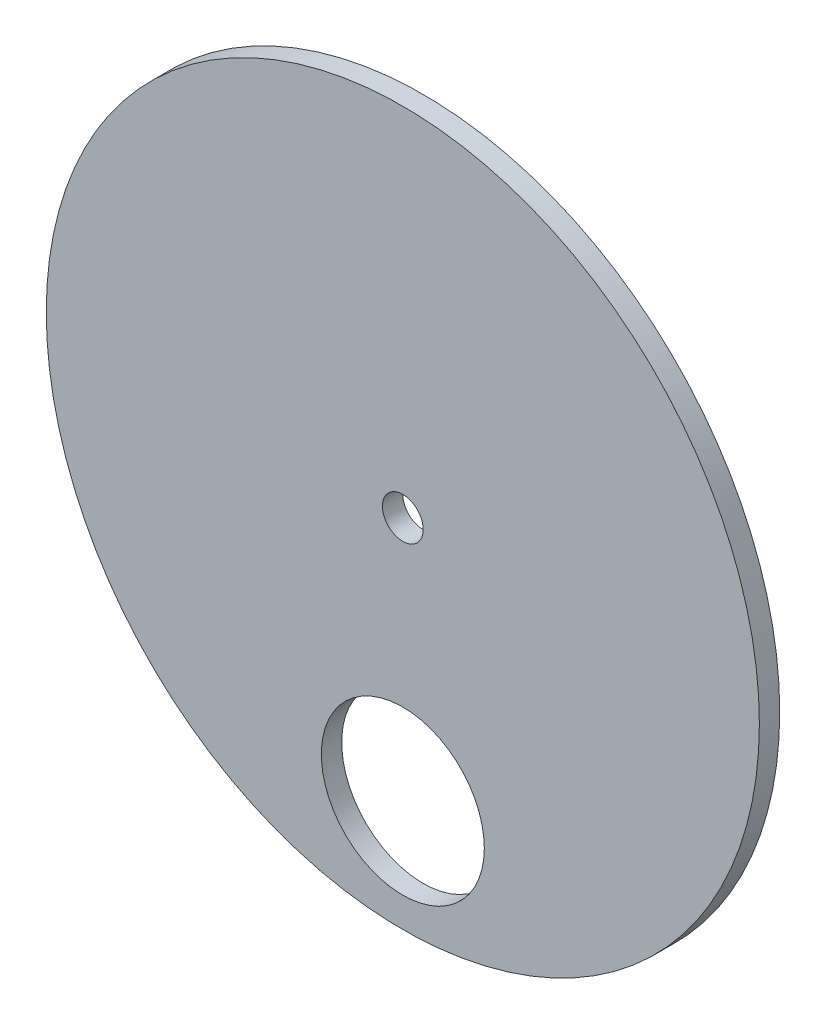
ISO-10303-21;
HEADER;
FILE_DESCRIPTION(('STEP AP214'),'2;1');
FILE_NAME('part.step','',(''),(''),'','','');
FILE_SCHEMA(('AUTOMOTIVE_DESIGN { 1 0 10303 214 1 1 1 1 }'));
ENDSEC;
DATA;
#1=APPLICATION_CONTEXT('core data for automotive mechanical design processes');
#2=APPLICATION_PROTOCOL_DEFINITION('international standard','automotive_design',2000,#1);
#3=PRODUCT_CONTEXT('',#1,'mechanical');
#4=PRODUCT('Part','Part','',(#3));
#5=PRODUCT_RELATED_PRODUCT_CATEGORY('part','',(#4));
#6=PRODUCT_DEFINITION_FORMATION('','',#4);
#7=PRODUCT_DEFINITION_CONTEXT('part definition',#1,'design');
#8=PRODUCT_DEFINITION('design','',#6,#7);
#9=PRODUCT_DEFINITION_SHAPE('','',#8);
#10=(LENGTH_UNIT() NAMED_UNIT(*) SI_UNIT(.MILLI.,.METRE.));
#11=(NAMED_UNIT(*) PLANE_ANGLE_UNIT() SI_UNIT($,.RADIAN.));
#12=(NAMED_UNIT(*) SI_UNIT($,.STERADIAN.) SOLID_ANGLE_UNIT());
#13=UNCERTAINTY_MEASURE_WITH_UNIT(LENGTH_MEASURE(1.E-05),#10,'distance_accuracy_value','');
#14=(GEOMETRIC_REPRESENTATION_CONTEXT(3) GLOBAL_UNCERTAINTY_ASSIGNED_CONTEXT((#13)) GLOBAL_UNIT_ASSIGNED_CONTEXT((#10,
#11,#12)) REPRESENTATION_CONTEXT('',''));
#15=CARTESIAN_POINT('',(0.,0.,0.));
#16=DIRECTION('',(0.,0.,1.));
#17=DIRECTION('',(1.,0.,0.));
#18=AXIS2_PLACEMENT_3D('',#15,#16,#17);
#19=CARTESIAN_POINT('',(0.,0.,10.));
#20=DIRECTION('',(0.,0.,-1.));
#21=DIRECTION('',(-1.,0.,0.));
#22=AXIS2_PLACEMENT_3D('',#19,#20,#21);
#23=CYLINDRICAL_SURFACE('',#22,175.);
#24=CARTESIAN_POINT('',(0.,0.,10.));
#25=DIRECTION('',(0.,0.,1.));
#26=DIRECTION('',(1.,0.,0.));
#27=AXIS2_PLACEMENT_3D('',#24,#25,#26);
#28=CIRCLE('',#27,175.);
#29=CARTESIAN_POINT('',(175.,0.,10.));
#30=VERTEX_POINT('',#29);
#31=EDGE_CURVE('E41',#30,#30,#28,.T.);
#32=ORIENTED_EDGE('',*,*,#31,.F.);
#33=EDGE_LOOP('',(#32));
#34=FACE_BOUND('',#33,.T.);
#35=CARTESIAN_POINT('',(0.,0.,0.));
#36=DIRECTION('',(0.,0.,1.));
#37=DIRECTION('',(1.,0.,0.));
#38=AXIS2_PLACEMENT_3D('',#35,#36,#37);
#39=CIRCLE('',#38,175.);
#40=CARTESIAN_POINT('',(175.,0.,0.));
#41=VERTEX_POINT('',#40);
#42=EDGE_CURVE('E52',#41,#41,#39,.T.);
#43=ORIENTED_EDGE('',*,*,#42,.T.);
#44=EDGE_LOOP('',(#43));
#45=FACE_BOUND('',#44,.T.);
#46=ADVANCED_FACE('F33',(#34,#45),#23,.T.);
#47=CARTESIAN_POINT('',(0.,-120.390309948585,10.));
#48=DIRECTION('',(0.,0.,-1.));
#49=DIRECTION('',(-1.,0.,0.));
#50=AXIS2_PLACEMENT_3D('',#47,#48,#49);
#51=CYLINDRICAL_SURFACE('',#50,40.);
#52=CARTESIAN_POINT('',(0.,-120.390309948585,10.));
#53=DIRECTION('',(0.,0.,1.));
#54=DIRECTION('',(1.,0.,0.));
#55=AXIS2_PLACEMENT_3D('',#52,#53,#54);
#56=CIRCLE('',#55,40.);
#57=CARTESIAN_POINT('',(40.,-120.390309948585,10.));
#58=VERTEX_POINT('',#57);
#59=EDGE_CURVE('E46',#58,#58,#56,.T.);
#60=ORIENTED_EDGE('',*,*,#59,.T.);
#61=EDGE_LOOP('',(#60));
#62=FACE_BOUND('',#61,.T.);
#63=CARTESIAN_POINT('',(0.,-120.390309948585,0.));
#64=DIRECTION('',(0.,0.,1.));
#65=DIRECTION('',(1.,0.,0.));
#66=AXIS2_PLACEMENT_3D('',#63,#64,#65);
#67=CIRCLE('',#66,40.);
#68=CARTESIAN_POINT('',(40.,-120.390309948585,0.));
#69=VERTEX_POINT('',#68);
#70=EDGE_CURVE('E50',#69,#69,#67,.T.);
#71=ORIENTED_EDGE('',*,*,#70,.F.);
#72=EDGE_LOOP('',(#71));
#73=FACE_BOUND('',#72,.T.);
#74=ADVANCED_FACE('F35',(#62,#73),#51,.F.);
#75=CARTESIAN_POINT('',(0.,0.,10.));
#76=DIRECTION('',(0.,0.,-1.));
#77=DIRECTION('',(-1.,0.,0.));
#78=AXIS2_PLACEMENT_3D('',#75,#76,#77);
#79=CYLINDRICAL_SURFACE('',#78,10.);
#80=CARTESIAN_POINT('',(0.,0.,10.));
#81=DIRECTION('',(0.,0.,1.));
#82=DIRECTION('',(1.,0.,0.));
#83=AXIS2_PLACEMENT_3D('',#80,#81,#82);
#84=CIRCLE('',#83,10.);
#85=CARTESIAN_POINT('',(10.,0.,10.));
#86=VERTEX_POINT('',#85);
#87=EDGE_CURVE('E10',#86,#86,#84,.T.);
#88=ORIENTED_EDGE('',*,*,#87,.T.);
#89=EDGE_LOOP('',(#88));
#90=FACE_BOUND('',#89,.T.);
#91=CARTESIAN_POINT('',(0.,0.,0.));
#92=DIRECTION('',(0.,0.,1.));
#93=DIRECTION('',(1.,0.,0.));
#94=AXIS2_PLACEMENT_3D('',#91,#92,#93);
#95=CIRCLE('',#94,10.);
#96=CARTESIAN_POINT('',(10.,0.,0.));
#97=VERTEX_POINT('',#96);
#98=EDGE_CURVE('E37',#97,#97,#95,.T.);
#99=ORIENTED_EDGE('',*,*,#98,.F.);
#100=EDGE_LOOP('',(#99));
#101=FACE_BOUND('',#100,.T.);
#102=ADVANCED_FACE('F68',(#90,#101),#79,.F.);
#103=CARTESIAN_POINT('',(0.,0.,10.));
#104=DIRECTION('',(0.,0.,1.));
#105=DIRECTION('',(1.,0.,0.));
#106=AXIS2_PLACEMENT_3D('',#103,#104,#105);
#107=PLANE('',#106);
#108=ORIENTED_EDGE('',*,*,#59,.F.);
#109=EDGE_LOOP('',(#108));
#110=FACE_BOUND('',#109,.T.);
#111=ORIENTED_EDGE('',*,*,#31,.T.);
#112=EDGE_LOOP('',(#111));
#113=FACE_BOUND('',#112,.T.);
#114=ORIENTED_EDGE('',*,*,#87,.F.);
#115=EDGE_LOOP('',(#114));
#116=FACE_BOUND('',#115,.T.);
#117=ADVANCED_FACE('F64',(#110,#113,#116),#107,.T.);
#118=CARTESIAN_POINT('',(0.,0.,0.));
#119=DIRECTION('',(0.,0.,1.));
#120=DIRECTION('',(1.,0.,0.));
#121=AXIS2_PLACEMENT_3D('',#118,#119,#120);
#122=PLANE('',#121);
#123=ORIENTED_EDGE('',*,*,#70,.T.);
#124=EDGE_LOOP('',(#123));
#125=FACE_BOUND('',#124,.T.);
#126=ORIENTED_EDGE('',*,*,#42,.F.);
#127=EDGE_LOOP('',(#126));
#128=FACE_BOUND('',#127,.T.);
#129=ORIENTED_EDGE('',*,*,#98,.T.);
#130=EDGE_LOOP('',(#129));
#131=FACE_BOUND('',#130,.T.);
#132=ADVANCED_FACE('F67',(#125,#128,#131),#122,.F.);
#133=CLOSED_SHELL('',(#46,#74,#102,#117,#132));
#134=MANIFOLD_SOLID_BREP('B2',#133);
#135=ADVANCED_BREP_SHAPE_REPRESENTATION('',(#18,#134),#14);
#136=SHAPE_DEFINITION_REPRESENTATION(#9,#135);
ENDSEC;
END-ISO-10303-21;
